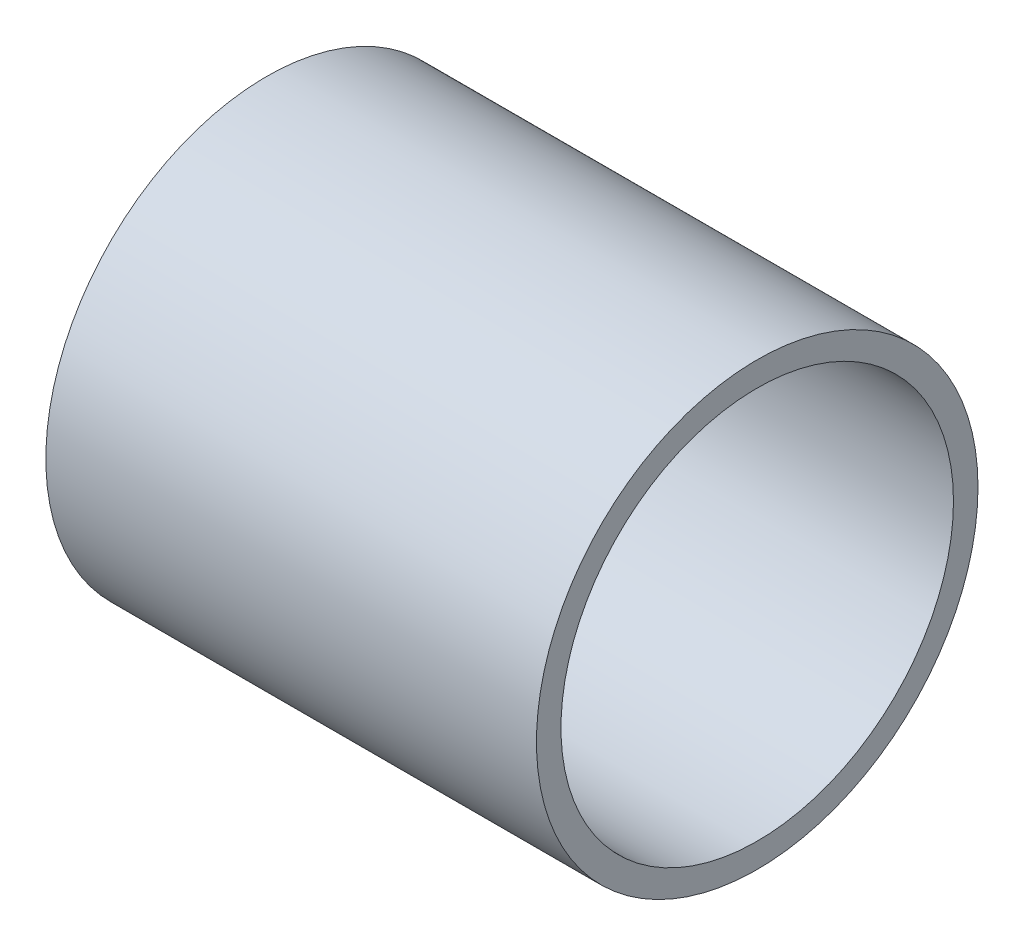
ISO-10303-21;
HEADER;
FILE_DESCRIPTION(('STEP AP214'),'2;1');
FILE_NAME('part.step','',(''),(''),'','','');
FILE_SCHEMA(('AUTOMOTIVE_DESIGN { 1 0 10303 214 1 1 1 1 }'));
ENDSEC;
DATA;
#1=APPLICATION_CONTEXT('core data for automotive mechanical design processes');
#2=APPLICATION_PROTOCOL_DEFINITION('international standard','automotive_design',2000,#1);
#3=PRODUCT_CONTEXT('',#1,'mechanical');
#4=PRODUCT('Part','Part','',(#3));
#5=PRODUCT_RELATED_PRODUCT_CATEGORY('part','',(#4));
#6=PRODUCT_DEFINITION_FORMATION('','',#4);
#7=PRODUCT_DEFINITION_CONTEXT('part definition',#1,'design');
#8=PRODUCT_DEFINITION('design','',#6,#7);
#9=PRODUCT_DEFINITION_SHAPE('','',#8);
#10=(LENGTH_UNIT() NAMED_UNIT(*) SI_UNIT(.MILLI.,.METRE.));
#11=(NAMED_UNIT(*) PLANE_ANGLE_UNIT() SI_UNIT($,.RADIAN.));
#12=(NAMED_UNIT(*) SI_UNIT($,.STERADIAN.) SOLID_ANGLE_UNIT());
#13=UNCERTAINTY_MEASURE_WITH_UNIT(LENGTH_MEASURE(1.E-05),#10,'distance_accuracy_value','');
#14=(GEOMETRIC_REPRESENTATION_CONTEXT(3) GLOBAL_UNCERTAINTY_ASSIGNED_CONTEXT((#13)) GLOBAL_UNIT_ASSIGNED_CONTEXT((#10,
#11,#12)) REPRESENTATION_CONTEXT('',''));
#15=CARTESIAN_POINT('',(0.,0.,0.));
#16=DIRECTION('',(0.,0.,1.));
#17=DIRECTION('',(1.,0.,0.));
#18=AXIS2_PLACEMENT_3D('',#15,#16,#17);
#19=CARTESIAN_POINT('',(5.,0.,0.));
#20=DIRECTION('',(1.,0.,0.));
#21=DIRECTION('',(0.,0.,-1.));
#22=AXIS2_PLACEMENT_3D('',#19,#20,#21);
#23=PLANE('',#22);
#24=CARTESIAN_POINT('',(5.,0.,0.));
#25=DIRECTION('',(1.,0.,0.));
#26=DIRECTION('',(0.,0.,-1.));
#27=AXIS2_PLACEMENT_3D('',#24,#25,#26);
#28=CIRCLE('',#27,2.25);
#29=CARTESIAN_POINT('',(5.,0.,-2.25));
#30=VERTEX_POINT('',#29);
#31=EDGE_CURVE('E10',#30,#30,#28,.T.);
#32=ORIENTED_EDGE('',*,*,#31,.T.);
#33=EDGE_LOOP('',(#32));
#34=FACE_BOUND('',#33,.T.);
#35=CARTESIAN_POINT('',(5.,0.,0.));
#36=DIRECTION('',(1.,0.,0.));
#37=DIRECTION('',(0.,0.,-1.));
#38=AXIS2_PLACEMENT_3D('',#35,#36,#37);
#39=CIRCLE('',#38,2.);
#40=CARTESIAN_POINT('',(5.,0.,-2.));
#41=VERTEX_POINT('',#40);
#42=EDGE_CURVE('E42',#41,#41,#39,.T.);
#43=ORIENTED_EDGE('',*,*,#42,.F.);
#44=EDGE_LOOP('',(#43));
#45=FACE_BOUND('',#44,.T.);
#46=ADVANCED_FACE('F31',(#34,#45),#23,.T.);
#47=CARTESIAN_POINT('',(0.,0.,0.));
#48=DIRECTION('',(1.,0.,0.));
#49=DIRECTION('',(0.,0.,-1.));
#50=AXIS2_PLACEMENT_3D('',#47,#48,#49);
#51=PLANE('',#50);
#52=CARTESIAN_POINT('',(0.,0.,0.));
#53=DIRECTION('',(1.,0.,0.));
#54=DIRECTION('',(0.,0.,-1.));
#55=AXIS2_PLACEMENT_3D('',#52,#53,#54);
#56=CIRCLE('',#55,2.25);
#57=CARTESIAN_POINT('',(0.,0.,-2.25));
#58=VERTEX_POINT('',#57);
#59=EDGE_CURVE('E35',#58,#58,#56,.T.);
#60=ORIENTED_EDGE('',*,*,#59,.F.);
#61=EDGE_LOOP('',(#60));
#62=FACE_BOUND('',#61,.T.);
#63=CARTESIAN_POINT('',(0.,0.,0.));
#64=DIRECTION('',(1.,0.,0.));
#65=DIRECTION('',(0.,0.,-1.));
#66=AXIS2_PLACEMENT_3D('',#63,#64,#65);
#67=CIRCLE('',#66,2.);
#68=CARTESIAN_POINT('',(0.,0.,-2.));
#69=VERTEX_POINT('',#68);
#70=EDGE_CURVE('E44',#69,#69,#67,.T.);
#71=ORIENTED_EDGE('',*,*,#70,.T.);
#72=EDGE_LOOP('',(#71));
#73=FACE_BOUND('',#72,.T.);
#74=ADVANCED_FACE('F54',(#62,#73),#51,.F.);
#75=CARTESIAN_POINT('',(5.,0.,0.));
#76=DIRECTION('',(-1.,0.,0.));
#77=DIRECTION('',(0.,0.,1.));
#78=AXIS2_PLACEMENT_3D('',#75,#76,#77);
#79=CYLINDRICAL_SURFACE('',#78,2.25);
#80=ORIENTED_EDGE('',*,*,#31,.F.);
#81=EDGE_LOOP('',(#80));
#82=FACE_BOUND('',#81,.T.);
#83=ORIENTED_EDGE('',*,*,#59,.T.);
#84=EDGE_LOOP('',(#83));
#85=FACE_BOUND('',#84,.T.);
#86=ADVANCED_FACE('F33',(#82,#85),#79,.T.);
#87=CARTESIAN_POINT('',(5.,0.,0.));
#88=DIRECTION('',(-1.,0.,0.));
#89=DIRECTION('',(0.,0.,1.));
#90=AXIS2_PLACEMENT_3D('',#87,#88,#89);
#91=CYLINDRICAL_SURFACE('',#90,2.);
#92=ORIENTED_EDGE('',*,*,#42,.T.);
#93=EDGE_LOOP('',(#92));
#94=FACE_BOUND('',#93,.T.);
#95=ORIENTED_EDGE('',*,*,#70,.F.);
#96=EDGE_LOOP('',(#95));
#97=FACE_BOUND('',#96,.T.);
#98=ADVANCED_FACE('F50',(#94,#97),#91,.F.);
#99=CLOSED_SHELL('',(#46,#74,#86,#98));
#100=MANIFOLD_SOLID_BREP('B2',#99);
#101=ADVANCED_BREP_SHAPE_REPRESENTATION('',(#18,#100),#14);
#102=SHAPE_DEFINITION_REPRESENTATION(#9,#101);
ENDSEC;
END-ISO-10303-21;
